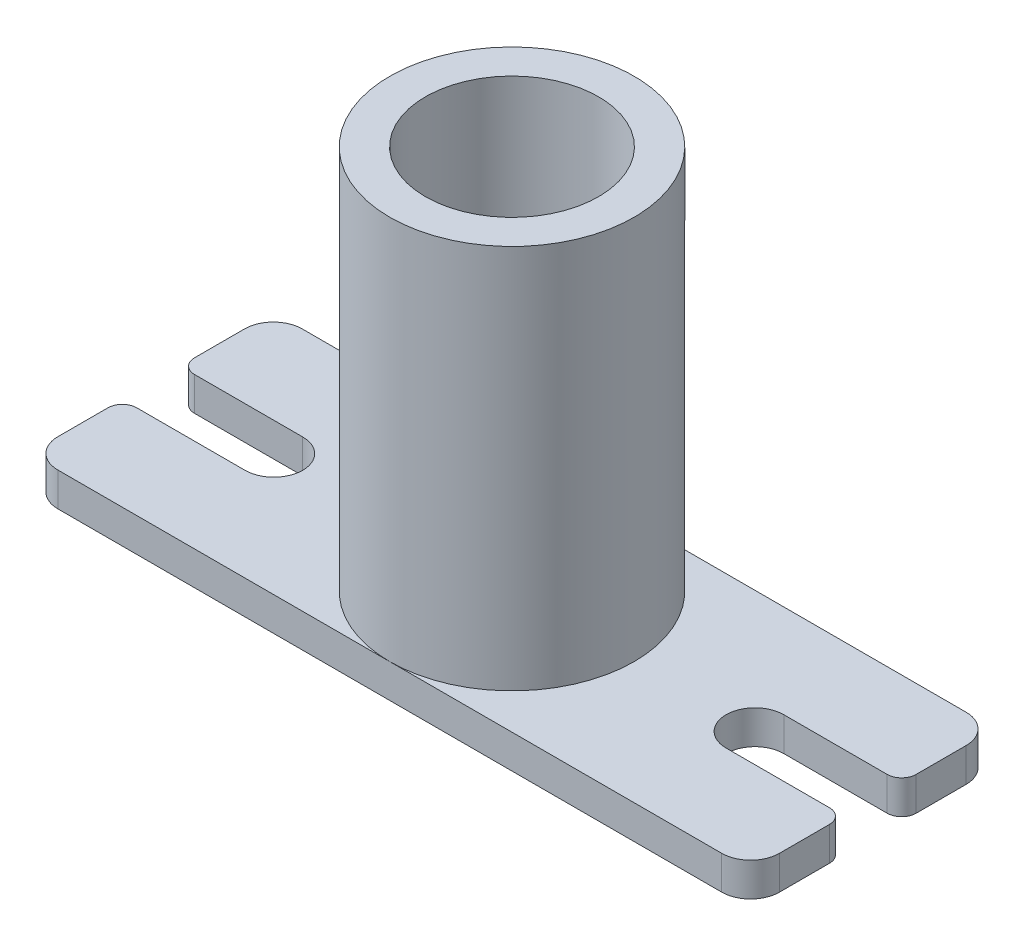
ISO-10303-21;
HEADER;
FILE_DESCRIPTION(('STEP AP214'),'2;1');
FILE_NAME('part.step','',(''),(''),'','','');
FILE_SCHEMA(('AUTOMOTIVE_DESIGN { 1 0 10303 214 1 1 1 1 }'));
ENDSEC;
DATA;
#1=APPLICATION_CONTEXT('core data for automotive mechanical design processes');
#2=APPLICATION_PROTOCOL_DEFINITION('international standard','automotive_design',2000,#1);
#3=PRODUCT_CONTEXT('',#1,'mechanical');
#4=PRODUCT('Part','Part','',(#3));
#5=PRODUCT_RELATED_PRODUCT_CATEGORY('part','',(#4));
#6=PRODUCT_DEFINITION_FORMATION('','',#4);
#7=PRODUCT_DEFINITION_CONTEXT('part definition',#1,'design');
#8=PRODUCT_DEFINITION('design','',#6,#7);
#9=PRODUCT_DEFINITION_SHAPE('','',#8);
#10=(LENGTH_UNIT() NAMED_UNIT(*) SI_UNIT(.MILLI.,.METRE.));
#11=(NAMED_UNIT(*) PLANE_ANGLE_UNIT() SI_UNIT($,.RADIAN.));
#12=(NAMED_UNIT(*) SI_UNIT($,.STERADIAN.) SOLID_ANGLE_UNIT());
#13=UNCERTAINTY_MEASURE_WITH_UNIT(LENGTH_MEASURE(1.E-05),#10,'distance_accuracy_value','');
#14=(GEOMETRIC_REPRESENTATION_CONTEXT(3) GLOBAL_UNCERTAINTY_ASSIGNED_CONTEXT((#13)) GLOBAL_UNIT_ASSIGNED_CONTEXT((#10,
#11,#12)) REPRESENTATION_CONTEXT('',''));
#15=CARTESIAN_POINT('',(0.,0.,0.));
#16=DIRECTION('',(0.,0.,1.));
#17=DIRECTION('',(1.,0.,0.));
#18=AXIS2_PLACEMENT_3D('',#15,#16,#17);
#19=CARTESIAN_POINT('',(3.20305311191606,3.5,-3.60082796255351));
#20=DIRECTION('',(0.,1.,0.));
#21=DIRECTION('',(0.,0.,1.));
#22=AXIS2_PLACEMENT_3D('',#19,#20,#21);
#23=PLANE('',#22);
#24=CARTESIAN_POINT('',(39.2030531119161,3.5,-8.10082796255352));
#25=DIRECTION('',(0.,1.,0.));
#26=DIRECTION('',(0.,0.,1.));
#27=AXIS2_PLACEMENT_3D('',#24,#25,#26);
#28=CIRCLE('',#27,12.7);
#29=CARTESIAN_POINT('',(39.2030531119161,3.5,4.59917203744653));
#30=VERTEX_POINT('',#29);
#31=CARTESIAN_POINT('',(39.2030531119161,3.5,-20.8008279625535));
#32=VERTEX_POINT('',#31);
#33=EDGE_CURVE('E230',#30,#32,#28,.T.);
#34=ORIENTED_EDGE('',*,*,#33,.F.);
#35=DIRECTION('',(1.,0.,0.));
#36=VECTOR('',#35,1.);
#37=CARTESIAN_POINT('',(4.70305311191608,3.5,4.59917203744648));
#38=LINE('',#37,#36);
#39=CARTESIAN_POINT('',(73.703053111916,3.5,4.59917203744648));
#40=VERTEX_POINT('',#39);
#41=EDGE_CURVE('E498',#30,#40,#38,.T.);
#42=ORIENTED_EDGE('',*,*,#41,.T.);
#43=CARTESIAN_POINT('',(73.703053111916,3.5,1.59917203744648));
#44=DIRECTION('',(0.,1.,0.));
#45=DIRECTION('',(0.,0.,1.));
#46=AXIS2_PLACEMENT_3D('',#43,#44,#45);
#47=CIRCLE('',#46,3.);
#48=CARTESIAN_POINT('',(76.703053111916,3.5,1.59917203744646));
#49=VERTEX_POINT('',#48);
#50=EDGE_CURVE('E488',#40,#49,#47,.T.);
#51=ORIENTED_EDGE('',*,*,#50,.T.);
#52=DIRECTION('',(0.,0.,-1.));
#53=VECTOR('',#52,1.);
#54=CARTESIAN_POINT('',(76.703053111916,3.5,-3.6008279625535));
#55=LINE('',#54,#53);
#56=CARTESIAN_POINT('',(76.703053111916,3.5,-3.6008279625535));
#57=VERTEX_POINT('',#56);
#58=EDGE_CURVE('E491',#49,#57,#55,.T.);
#59=ORIENTED_EDGE('',*,*,#58,.T.);
#60=CARTESIAN_POINT('',(75.203053111916,3.5,-3.60082796255351));
#61=DIRECTION('',(0.,1.,0.));
#62=DIRECTION('',(0.,0.,-1.));
#63=AXIS2_PLACEMENT_3D('',#60,#61,#62);
#64=CIRCLE('',#63,1.5);
#65=CARTESIAN_POINT('',(75.203053111916,3.5,-5.10082796255351));
#66=VERTEX_POINT('',#65);
#67=EDGE_CURVE('E496',#57,#66,#64,.T.);
#68=ORIENTED_EDGE('',*,*,#67,.T.);
#69=DIRECTION('',(-1.,0.,0.));
#70=VECTOR('',#69,1.);
#71=CARTESIAN_POINT('',(64.4530531119161,3.5,-5.10082796255351));
#72=LINE('',#71,#70);
#73=CARTESIAN_POINT('',(64.4530531119161,3.5,-5.10082796255351));
#74=VERTEX_POINT('',#73);
#75=EDGE_CURVE('E504',#66,#74,#72,.T.);
#76=ORIENTED_EDGE('',*,*,#75,.T.);
#77=CARTESIAN_POINT('',(64.4530531119161,3.5,-8.10082796255352));
#78=DIRECTION('',(0.,-1.,0.));
#79=DIRECTION('',(0.,0.,1.));
#80=AXIS2_PLACEMENT_3D('',#77,#78,#79);
#81=CIRCLE('',#80,3.00000000000001);
#82=CARTESIAN_POINT('',(64.4530531119161,3.5,-11.1008279625535));
#83=VERTEX_POINT('',#82);
#84=EDGE_CURVE('E507',#74,#83,#81,.T.);
#85=ORIENTED_EDGE('',*,*,#84,.T.);
#86=DIRECTION('',(1.,0.,0.));
#87=VECTOR('',#86,1.);
#88=CARTESIAN_POINT('',(64.4530531119161,3.5,-11.1008279625535));
#89=LINE('',#88,#87);
#90=CARTESIAN_POINT('',(75.203053111916,3.5,-11.1008279625535));
#91=VERTEX_POINT('',#90);
#92=EDGE_CURVE('E510',#83,#91,#89,.T.);
#93=ORIENTED_EDGE('',*,*,#92,.T.);
#94=CARTESIAN_POINT('',(75.203053111916,3.5,-12.6008279625535));
#95=DIRECTION('',(0.,1.,0.));
#96=DIRECTION('',(0.,0.,1.));
#97=AXIS2_PLACEMENT_3D('',#94,#95,#96);
#98=CIRCLE('',#97,1.5);
#99=CARTESIAN_POINT('',(76.703053111916,3.5,-12.6008279625535));
#100=VERTEX_POINT('',#99);
#101=EDGE_CURVE('E513',#91,#100,#98,.T.);
#102=ORIENTED_EDGE('',*,*,#101,.T.);
#103=DIRECTION('',(0.,0.,-1.));
#104=VECTOR('',#103,1.);
#105=CARTESIAN_POINT('',(76.703053111916,3.5,-17.8008279625535));
#106=LINE('',#105,#104);
#107=CARTESIAN_POINT('',(76.703053111916,3.5,-17.8008279625535));
#108=VERTEX_POINT('',#107);
#109=EDGE_CURVE('E516',#100,#108,#106,.T.);
#110=ORIENTED_EDGE('',*,*,#109,.T.);
#111=CARTESIAN_POINT('',(73.703053111916,3.5,-17.8008279625535));
#112=DIRECTION('',(0.,1.,0.));
#113=DIRECTION('',(0.,0.,-1.));
#114=AXIS2_PLACEMENT_3D('',#111,#112,#113);
#115=CIRCLE('',#114,3.);
#116=CARTESIAN_POINT('',(73.703053111916,3.5,-20.8008279625535));
#117=VERTEX_POINT('',#116);
#118=EDGE_CURVE('E519',#108,#117,#115,.T.);
#119=ORIENTED_EDGE('',*,*,#118,.T.);
#120=DIRECTION('',(-1.,0.,0.));
#121=VECTOR('',#120,1.);
#122=CARTESIAN_POINT('',(4.70305311191608,3.5,-20.8008279625535));
#123=LINE('',#122,#121);
#124=EDGE_CURVE('E523',#117,#32,#123,.T.);
#125=ORIENTED_EDGE('',*,*,#124,.T.);
#126=EDGE_LOOP('',(#34,#42,#51,#59,#68,#76,#85,#93,#102,#110,#119,#125));
#127=FACE_BOUND('',#126,.T.);
#128=ADVANCED_FACE('F43',(#127),#23,.T.);
#129=CARTESIAN_POINT('',(3.20305311191606,3.5,-3.60082796255351));
#130=DIRECTION('',(0.,-1.,0.));
#131=DIRECTION('',(0.,0.,-1.));
#132=AXIS2_PLACEMENT_3D('',#129,#130,#131);
#133=CYLINDRICAL_SURFACE('',#132,1.5);
#134=CARTESIAN_POINT('',(3.20305311191606,0.,-3.60082796255351));
#135=DIRECTION('',(0.,1.,0.));
#136=DIRECTION('',(0.,0.,1.));
#137=AXIS2_PLACEMENT_3D('',#134,#135,#136);
#138=CIRCLE('',#137,1.5);
#139=CARTESIAN_POINT('',(3.20305311191607,0.,-5.10082796255351));
#140=VERTEX_POINT('',#139);
#141=CARTESIAN_POINT('',(1.70305311191606,0.,-3.6008279625535));
#142=VERTEX_POINT('',#141);
#143=EDGE_CURVE('E225',#140,#142,#138,.T.);
#144=ORIENTED_EDGE('',*,*,#143,.T.);
#145=DIRECTION('',(0.,-1.,0.));
#146=VECTOR('',#145,1.);
#147=CARTESIAN_POINT('',(1.70305311191606,3.5,-3.6008279625535));
#148=LINE('',#147,#146);
#149=CARTESIAN_POINT('',(1.70305311191606,3.5,-3.6008279625535));
#150=VERTEX_POINT('',#149);
#151=EDGE_CURVE('E351',#150,#142,#148,.T.);
#152=ORIENTED_EDGE('',*,*,#151,.F.);
#153=CARTESIAN_POINT('',(3.20305311191606,3.5,-3.60082796255351));
#154=DIRECTION('',(0.,1.,0.));
#155=DIRECTION('',(0.,0.,1.));
#156=AXIS2_PLACEMENT_3D('',#153,#154,#155);
#157=CIRCLE('',#156,1.5);
#158=CARTESIAN_POINT('',(3.20305311191607,3.5,-5.10082796255351));
#159=VERTEX_POINT('',#158);
#160=EDGE_CURVE('E285',#159,#150,#157,.T.);
#161=ORIENTED_EDGE('',*,*,#160,.F.);
#162=DIRECTION('',(0.,-1.,0.));
#163=VECTOR('',#162,1.);
#164=CARTESIAN_POINT('',(3.20305311191607,3.5,-5.10082796255351));
#165=LINE('',#164,#163);
#166=EDGE_CURVE('E221',#159,#140,#165,.T.);
#167=ORIENTED_EDGE('',*,*,#166,.T.);
#168=EDGE_LOOP('',(#144,#152,#161,#167));
#169=FACE_BOUND('',#168,.T.);
#170=ADVANCED_FACE('F45',(#169),#133,.T.);
#171=CARTESIAN_POINT('',(1.70305311191606,3.5,-3.6008279625535));
#172=DIRECTION('',(1.,0.,0.));
#173=DIRECTION('',(0.,0.,-1.));
#174=AXIS2_PLACEMENT_3D('',#171,#172,#173);
#175=PLANE('',#174);
#176=DIRECTION('',(0.,0.,1.));
#177=VECTOR('',#176,1.);
#178=CARTESIAN_POINT('',(1.70305311191606,0.,-3.6008279625535));
#179=LINE('',#178,#177);
#180=CARTESIAN_POINT('',(1.70305311191606,0.,1.59917203744646));
#181=VERTEX_POINT('',#180);
#182=EDGE_CURVE('E229',#142,#181,#179,.T.);
#183=ORIENTED_EDGE('',*,*,#182,.T.);
#184=DIRECTION('',(0.,-1.,0.));
#185=VECTOR('',#184,1.);
#186=CARTESIAN_POINT('',(1.70305311191606,3.5,1.59917203744646));
#187=LINE('',#186,#185);
#188=CARTESIAN_POINT('',(1.70305311191606,3.5,1.59917203744646));
#189=VERTEX_POINT('',#188);
#190=EDGE_CURVE('E348',#189,#181,#187,.T.);
#191=ORIENTED_EDGE('',*,*,#190,.F.);
#192=DIRECTION('',(0.,0.,1.));
#193=VECTOR('',#192,1.);
#194=CARTESIAN_POINT('',(1.70305311191606,3.5,-3.6008279625535));
#195=LINE('',#194,#193);
#196=EDGE_CURVE('E144',#150,#189,#195,.T.);
#197=ORIENTED_EDGE('',*,*,#196,.F.);
#198=ORIENTED_EDGE('',*,*,#151,.T.);
#199=EDGE_LOOP('',(#183,#191,#197,#198));
#200=FACE_BOUND('',#199,.T.);
#201=ADVANCED_FACE('F395',(#200),#175,.F.);
#202=CARTESIAN_POINT('',(4.70305311191605,3.5,1.59917203744648));
#203=DIRECTION('',(0.,-1.,0.));
#204=DIRECTION('',(0.,0.,-1.));
#205=AXIS2_PLACEMENT_3D('',#202,#203,#204);
#206=CYLINDRICAL_SURFACE('',#205,3.);
#207=CARTESIAN_POINT('',(4.70305311191605,0.,1.59917203744648));
#208=DIRECTION('',(0.,1.,0.));
#209=DIRECTION('',(0.,0.,-1.));
#210=AXIS2_PLACEMENT_3D('',#207,#208,#209);
#211=CIRCLE('',#210,3.);
#212=CARTESIAN_POINT('',(4.70305311191608,0.,4.59917203744648));
#213=VERTEX_POINT('',#212);
#214=EDGE_CURVE('E233',#181,#213,#211,.T.);
#215=ORIENTED_EDGE('',*,*,#214,.T.);
#216=DIRECTION('',(0.,-1.,0.));
#217=VECTOR('',#216,1.);
#218=CARTESIAN_POINT('',(4.70305311191608,3.5,4.59917203744648));
#219=LINE('',#218,#217);
#220=CARTESIAN_POINT('',(4.70305311191608,3.5,4.59917203744648));
#221=VERTEX_POINT('',#220);
#222=EDGE_CURVE('E344',#221,#213,#219,.T.);
#223=ORIENTED_EDGE('',*,*,#222,.F.);
#224=CARTESIAN_POINT('',(4.70305311191605,3.5,1.59917203744648));
#225=DIRECTION('',(0.,1.,0.));
#226=DIRECTION('',(0.,0.,-1.));
#227=AXIS2_PLACEMENT_3D('',#224,#225,#226);
#228=CIRCLE('',#227,3.);
#229=EDGE_CURVE('E479',#189,#221,#228,.T.);
#230=ORIENTED_EDGE('',*,*,#229,.F.);
#231=ORIENTED_EDGE('',*,*,#190,.T.);
#232=EDGE_LOOP('',(#215,#223,#230,#231));
#233=FACE_BOUND('',#232,.T.);
#234=ADVANCED_FACE('F468',(#233),#206,.T.);
#235=CARTESIAN_POINT('',(4.70305311191608,3.5,4.59917203744648));
#236=DIRECTION('',(0.,0.,-1.));
#237=DIRECTION('',(-1.,0.,0.));
#238=AXIS2_PLACEMENT_3D('',#235,#236,#237);
#239=PLANE('',#238);
#240=DIRECTION('',(1.,0.,0.));
#241=VECTOR('',#240,1.);
#242=CARTESIAN_POINT('',(4.70305311191608,0.,4.59917203744648));
#243=LINE('',#242,#241);
#244=CARTESIAN_POINT('',(73.703053111916,0.,4.59917203744648));
#245=VERTEX_POINT('',#244);
#246=EDGE_CURVE('E236',#213,#245,#243,.T.);
#247=ORIENTED_EDGE('',*,*,#246,.T.);
#248=DIRECTION('',(0.,-1.,0.));
#249=VECTOR('',#248,1.);
#250=CARTESIAN_POINT('',(73.703053111916,3.5,4.59917203744648));
#251=LINE('',#250,#249);
#252=EDGE_CURVE('E340',#40,#245,#251,.T.);
#253=ORIENTED_EDGE('',*,*,#252,.F.);
#254=ORIENTED_EDGE('',*,*,#41,.F.);
#255=EDGE_CURVE('E492',#221,#30,#38,.T.);
#256=ORIENTED_EDGE('',*,*,#255,.F.);
#257=ORIENTED_EDGE('',*,*,#222,.T.);
#258=EDGE_LOOP('',(#247,#253,#254,#256,#257));
#259=FACE_BOUND('',#258,.T.);
#260=ADVANCED_FACE('F464',(#259),#239,.F.);
#261=CARTESIAN_POINT('',(73.703053111916,3.5,1.59917203744648));
#262=DIRECTION('',(0.,-1.,0.));
#263=DIRECTION('',(0.,0.,-1.));
#264=AXIS2_PLACEMENT_3D('',#261,#262,#263);
#265=CYLINDRICAL_SURFACE('',#264,3.);
#266=CARTESIAN_POINT('',(73.703053111916,0.,1.59917203744648));
#267=DIRECTION('',(0.,1.,0.));
#268=DIRECTION('',(0.,0.,1.));
#269=AXIS2_PLACEMENT_3D('',#266,#267,#268);
#270=CIRCLE('',#269,3.);
#271=CARTESIAN_POINT('',(76.703053111916,0.,1.59917203744646));
#272=VERTEX_POINT('',#271);
#273=EDGE_CURVE('E239',#245,#272,#270,.T.);
#274=ORIENTED_EDGE('',*,*,#273,.T.);
#275=DIRECTION('',(0.,-1.,0.));
#276=VECTOR('',#275,1.);
#277=CARTESIAN_POINT('',(76.703053111916,3.5,1.59917203744646));
#278=LINE('',#277,#276);
#279=EDGE_CURVE('E336',#49,#272,#278,.T.);
#280=ORIENTED_EDGE('',*,*,#279,.F.);
#281=ORIENTED_EDGE('',*,*,#50,.F.);
#282=ORIENTED_EDGE('',*,*,#252,.T.);
#283=EDGE_LOOP('',(#274,#280,#281,#282));
#284=FACE_BOUND('',#283,.T.);
#285=ADVANCED_FACE('F460',(#284),#265,.T.);
#286=CARTESIAN_POINT('',(76.703053111916,3.5,-3.6008279625535));
#287=DIRECTION('',(-1.,0.,0.));
#288=DIRECTION('',(0.,0.,1.));
#289=AXIS2_PLACEMENT_3D('',#286,#287,#288);
#290=PLANE('',#289);
#291=DIRECTION('',(0.,0.,-1.));
#292=VECTOR('',#291,1.);
#293=CARTESIAN_POINT('',(76.703053111916,0.,-3.6008279625535));
#294=LINE('',#293,#292);
#295=CARTESIAN_POINT('',(76.703053111916,0.,-3.6008279625535));
#296=VERTEX_POINT('',#295);
#297=EDGE_CURVE('E242',#272,#296,#294,.T.);
#298=ORIENTED_EDGE('',*,*,#297,.T.);
#299=DIRECTION('',(0.,-1.,0.));
#300=VECTOR('',#299,1.);
#301=CARTESIAN_POINT('',(76.703053111916,3.5,-3.6008279625535));
#302=LINE('',#301,#300);
#303=EDGE_CURVE('E332',#57,#296,#302,.T.);
#304=ORIENTED_EDGE('',*,*,#303,.F.);
#305=ORIENTED_EDGE('',*,*,#58,.F.);
#306=ORIENTED_EDGE('',*,*,#279,.T.);
#307=EDGE_LOOP('',(#298,#304,#305,#306));
#308=FACE_BOUND('',#307,.T.);
#309=ADVANCED_FACE('F456',(#308),#290,.F.);
#310=CARTESIAN_POINT('',(75.203053111916,3.5,-3.60082796255351));
#311=DIRECTION('',(0.,-1.,0.));
#312=DIRECTION('',(0.,0.,-1.));
#313=AXIS2_PLACEMENT_3D('',#310,#311,#312);
#314=CYLINDRICAL_SURFACE('',#313,1.5);
#315=CARTESIAN_POINT('',(75.203053111916,0.,-3.60082796255351));
#316=DIRECTION('',(0.,1.,0.));
#317=DIRECTION('',(0.,0.,-1.));
#318=AXIS2_PLACEMENT_3D('',#315,#316,#317);
#319=CIRCLE('',#318,1.5);
#320=CARTESIAN_POINT('',(75.203053111916,0.,-5.10082796255351));
#321=VERTEX_POINT('',#320);
#322=EDGE_CURVE('E245',#296,#321,#319,.T.);
#323=ORIENTED_EDGE('',*,*,#322,.T.);
#324=DIRECTION('',(0.,-1.,0.));
#325=VECTOR('',#324,1.);
#326=CARTESIAN_POINT('',(75.203053111916,3.5,-5.10082796255351));
#327=LINE('',#326,#325);
#328=EDGE_CURVE('E328',#66,#321,#327,.T.);
#329=ORIENTED_EDGE('',*,*,#328,.F.);
#330=ORIENTED_EDGE('',*,*,#67,.F.);
#331=ORIENTED_EDGE('',*,*,#303,.T.);
#332=EDGE_LOOP('',(#323,#329,#330,#331));
#333=FACE_BOUND('',#332,.T.);
#334=ADVANCED_FACE('F452',(#333),#314,.T.);
#335=CARTESIAN_POINT('',(64.4530531119161,3.5,-5.10082796255351));
#336=DIRECTION('',(0.,0.,1.));
#337=DIRECTION('',(1.,0.,0.));
#338=AXIS2_PLACEMENT_3D('',#335,#336,#337);
#339=PLANE('',#338);
#340=DIRECTION('',(-1.,0.,0.));
#341=VECTOR('',#340,1.);
#342=CARTESIAN_POINT('',(64.4530531119161,0.,-5.10082796255351));
#343=LINE('',#342,#341);
#344=CARTESIAN_POINT('',(64.4530531119161,0.,-5.10082796255351));
#345=VERTEX_POINT('',#344);
#346=EDGE_CURVE('E248',#321,#345,#343,.T.);
#347=ORIENTED_EDGE('',*,*,#346,.T.);
#348=DIRECTION('',(0.,-1.,0.));
#349=VECTOR('',#348,1.);
#350=CARTESIAN_POINT('',(64.4530531119161,3.5,-5.10082796255351));
#351=LINE('',#350,#349);
#352=EDGE_CURVE('E324',#74,#345,#351,.T.);
#353=ORIENTED_EDGE('',*,*,#352,.F.);
#354=ORIENTED_EDGE('',*,*,#75,.F.);
#355=ORIENTED_EDGE('',*,*,#328,.T.);
#356=EDGE_LOOP('',(#347,#353,#354,#355));
#357=FACE_BOUND('',#356,.T.);
#358=ADVANCED_FACE('F448',(#357),#339,.F.);
#359=CARTESIAN_POINT('',(64.4530531119161,3.5,-8.10082796255352));
#360=DIRECTION('',(0.,-1.,0.));
#361=DIRECTION('',(0.,0.,-1.));
#362=AXIS2_PLACEMENT_3D('',#359,#360,#361);
#363=CYLINDRICAL_SURFACE('',#362,3.00000000000001);
#364=CARTESIAN_POINT('',(64.4530531119161,0.,-8.10082796255352));
#365=DIRECTION('',(0.,-1.,0.));
#366=DIRECTION('',(0.,0.,1.));
#367=AXIS2_PLACEMENT_3D('',#364,#365,#366);
#368=CIRCLE('',#367,3.00000000000001);
#369=CARTESIAN_POINT('',(64.4530531119161,0.,-11.1008279625535));
#370=VERTEX_POINT('',#369);
#371=EDGE_CURVE('E251',#345,#370,#368,.T.);
#372=ORIENTED_EDGE('',*,*,#371,.T.);
#373=DIRECTION('',(0.,-1.,0.));
#374=VECTOR('',#373,1.);
#375=CARTESIAN_POINT('',(64.4530531119161,3.5,-11.1008279625535));
#376=LINE('',#375,#374);
#377=EDGE_CURVE('E320',#83,#370,#376,.T.);
#378=ORIENTED_EDGE('',*,*,#377,.F.);
#379=ORIENTED_EDGE('',*,*,#84,.F.);
#380=ORIENTED_EDGE('',*,*,#352,.T.);
#381=EDGE_LOOP('',(#372,#378,#379,#380));
#382=FACE_BOUND('',#381,.T.);
#383=ADVANCED_FACE('F444',(#382),#363,.F.);
#384=CARTESIAN_POINT('',(64.4530531119161,3.5,-11.1008279625535));
#385=DIRECTION('',(0.,0.,-1.));
#386=DIRECTION('',(-1.,0.,0.));
#387=AXIS2_PLACEMENT_3D('',#384,#385,#386);
#388=PLANE('',#387);
#389=DIRECTION('',(1.,0.,0.));
#390=VECTOR('',#389,1.);
#391=CARTESIAN_POINT('',(64.4530531119161,0.,-11.1008279625535));
#392=LINE('',#391,#390);
#393=CARTESIAN_POINT('',(75.203053111916,0.,-11.1008279625535));
#394=VERTEX_POINT('',#393);
#395=EDGE_CURVE('E254',#370,#394,#392,.T.);
#396=ORIENTED_EDGE('',*,*,#395,.T.);
#397=DIRECTION('',(0.,-1.,0.));
#398=VECTOR('',#397,1.);
#399=CARTESIAN_POINT('',(75.203053111916,3.5,-11.1008279625535));
#400=LINE('',#399,#398);
#401=EDGE_CURVE('E316',#91,#394,#400,.T.);
#402=ORIENTED_EDGE('',*,*,#401,.F.);
#403=ORIENTED_EDGE('',*,*,#92,.F.);
#404=ORIENTED_EDGE('',*,*,#377,.T.);
#405=EDGE_LOOP('',(#396,#402,#403,#404));
#406=FACE_BOUND('',#405,.T.);
#407=ADVANCED_FACE('F440',(#406),#388,.F.);
#408=CARTESIAN_POINT('',(75.203053111916,3.5,-12.6008279625535));
#409=DIRECTION('',(0.,-1.,0.));
#410=DIRECTION('',(0.,0.,-1.));
#411=AXIS2_PLACEMENT_3D('',#408,#409,#410);
#412=CYLINDRICAL_SURFACE('',#411,1.5);
#413=CARTESIAN_POINT('',(75.203053111916,0.,-12.6008279625535));
#414=DIRECTION('',(0.,1.,0.));
#415=DIRECTION('',(0.,0.,1.));
#416=AXIS2_PLACEMENT_3D('',#413,#414,#415);
#417=CIRCLE('',#416,1.5);
#418=CARTESIAN_POINT('',(76.703053111916,0.,-12.6008279625535));
#419=VERTEX_POINT('',#418);
#420=EDGE_CURVE('E257',#394,#419,#417,.T.);
#421=ORIENTED_EDGE('',*,*,#420,.T.);
#422=DIRECTION('',(0.,-1.,0.));
#423=VECTOR('',#422,1.);
#424=CARTESIAN_POINT('',(76.703053111916,3.5,-12.6008279625535));
#425=LINE('',#424,#423);
#426=EDGE_CURVE('E312',#100,#419,#425,.T.);
#427=ORIENTED_EDGE('',*,*,#426,.F.);
#428=ORIENTED_EDGE('',*,*,#101,.F.);
#429=ORIENTED_EDGE('',*,*,#401,.T.);
#430=EDGE_LOOP('',(#421,#427,#428,#429));
#431=FACE_BOUND('',#430,.T.);
#432=ADVANCED_FACE('F436',(#431),#412,.T.);
#433=CARTESIAN_POINT('',(76.703053111916,3.5,-17.8008279625535));
#434=DIRECTION('',(-1.,0.,0.));
#435=DIRECTION('',(0.,0.,1.));
#436=AXIS2_PLACEMENT_3D('',#433,#434,#435);
#437=PLANE('',#436);
#438=DIRECTION('',(0.,0.,-1.));
#439=VECTOR('',#438,1.);
#440=CARTESIAN_POINT('',(76.703053111916,0.,-17.8008279625535));
#441=LINE('',#440,#439);
#442=CARTESIAN_POINT('',(76.703053111916,0.,-17.8008279625535));
#443=VERTEX_POINT('',#442);
#444=EDGE_CURVE('E260',#419,#443,#441,.T.);
#445=ORIENTED_EDGE('',*,*,#444,.T.);
#446=DIRECTION('',(0.,-1.,0.));
#447=VECTOR('',#446,1.);
#448=CARTESIAN_POINT('',(76.703053111916,3.5,-17.8008279625535));
#449=LINE('',#448,#447);
#450=EDGE_CURVE('E308',#108,#443,#449,.T.);
#451=ORIENTED_EDGE('',*,*,#450,.F.);
#452=ORIENTED_EDGE('',*,*,#109,.F.);
#453=ORIENTED_EDGE('',*,*,#426,.T.);
#454=EDGE_LOOP('',(#445,#451,#452,#453));
#455=FACE_BOUND('',#454,.T.);
#456=ADVANCED_FACE('F432',(#455),#437,.F.);
#457=CARTESIAN_POINT('',(73.703053111916,3.5,-17.8008279625535));
#458=DIRECTION('',(0.,-1.,0.));
#459=DIRECTION('',(0.,0.,-1.));
#460=AXIS2_PLACEMENT_3D('',#457,#458,#459);
#461=CYLINDRICAL_SURFACE('',#460,3.);
#462=CARTESIAN_POINT('',(73.703053111916,0.,-17.8008279625535));
#463=DIRECTION('',(0.,1.,0.));
#464=DIRECTION('',(0.,0.,-1.));
#465=AXIS2_PLACEMENT_3D('',#462,#463,#464);
#466=CIRCLE('',#465,3.);
#467=CARTESIAN_POINT('',(73.703053111916,0.,-20.8008279625535));
#468=VERTEX_POINT('',#467);
#469=EDGE_CURVE('E263',#443,#468,#466,.T.);
#470=ORIENTED_EDGE('',*,*,#469,.T.);
#471=DIRECTION('',(0.,-1.,0.));
#472=VECTOR('',#471,1.);
#473=CARTESIAN_POINT('',(73.703053111916,3.5,-20.8008279625535));
#474=LINE('',#473,#472);
#475=EDGE_CURVE('E304',#117,#468,#474,.T.);
#476=ORIENTED_EDGE('',*,*,#475,.F.);
#477=ORIENTED_EDGE('',*,*,#118,.F.);
#478=ORIENTED_EDGE('',*,*,#450,.T.);
#479=EDGE_LOOP('',(#470,#476,#477,#478));
#480=FACE_BOUND('',#479,.T.);
#481=ADVANCED_FACE('F428',(#480),#461,.T.);
#482=CARTESIAN_POINT('',(4.70305311191608,3.5,-20.8008279625535));
#483=DIRECTION('',(0.,0.,1.));
#484=DIRECTION('',(1.,0.,0.));
#485=AXIS2_PLACEMENT_3D('',#482,#483,#484);
#486=PLANE('',#485);
#487=DIRECTION('',(-1.,0.,0.));
#488=VECTOR('',#487,1.);
#489=CARTESIAN_POINT('',(4.70305311191608,0.,-20.8008279625535));
#490=LINE('',#489,#488);
#491=CARTESIAN_POINT('',(4.70305311191608,0.,-20.8008279625535));
#492=VERTEX_POINT('',#491);
#493=EDGE_CURVE('E266',#468,#492,#490,.T.);
#494=ORIENTED_EDGE('',*,*,#493,.T.);
#495=DIRECTION('',(0.,-1.,0.));
#496=VECTOR('',#495,1.);
#497=CARTESIAN_POINT('',(4.70305311191608,3.5,-20.8008279625535));
#498=LINE('',#497,#496);
#499=CARTESIAN_POINT('',(4.70305311191608,3.5,-20.8008279625535));
#500=VERTEX_POINT('',#499);
#501=EDGE_CURVE('E300',#500,#492,#498,.T.);
#502=ORIENTED_EDGE('',*,*,#501,.F.);
#503=EDGE_CURVE('E522',#32,#500,#123,.T.);
#504=ORIENTED_EDGE('',*,*,#503,.F.);
#505=ORIENTED_EDGE('',*,*,#124,.F.);
#506=ORIENTED_EDGE('',*,*,#475,.T.);
#507=EDGE_LOOP('',(#494,#502,#504,#505,#506));
#508=FACE_BOUND('',#507,.T.);
#509=ADVANCED_FACE('F424',(#508),#486,.F.);
#510=CARTESIAN_POINT('',(4.70305311191605,3.5,-17.8008279625535));
#511=DIRECTION('',(0.,-1.,0.));
#512=DIRECTION('',(0.,0.,-1.));
#513=AXIS2_PLACEMENT_3D('',#510,#511,#512);
#514=CYLINDRICAL_SURFACE('',#513,3.);
#515=CARTESIAN_POINT('',(4.70305311191605,0.,-17.8008279625535));
#516=DIRECTION('',(0.,1.,0.));
#517=DIRECTION('',(0.,0.,1.));
#518=AXIS2_PLACEMENT_3D('',#515,#516,#517);
#519=CIRCLE('',#518,3.);
#520=CARTESIAN_POINT('',(1.70305311191606,0.,-17.8008279625535));
#521=VERTEX_POINT('',#520);
#522=EDGE_CURVE('E269',#492,#521,#519,.T.);
#523=ORIENTED_EDGE('',*,*,#522,.T.);
#524=DIRECTION('',(0.,-1.,0.));
#525=VECTOR('',#524,1.);
#526=CARTESIAN_POINT('',(1.70305311191606,3.5,-17.8008279625535));
#527=LINE('',#526,#525);
#528=CARTESIAN_POINT('',(1.70305311191606,3.5,-17.8008279625535));
#529=VERTEX_POINT('',#528);
#530=EDGE_CURVE('E296',#529,#521,#527,.T.);
#531=ORIENTED_EDGE('',*,*,#530,.F.);
#532=CARTESIAN_POINT('',(4.70305311191605,3.5,-17.8008279625535));
#533=DIRECTION('',(0.,1.,0.));
#534=DIRECTION('',(0.,0.,1.));
#535=AXIS2_PLACEMENT_3D('',#532,#533,#534);
#536=CIRCLE('',#535,3.);
#537=EDGE_CURVE('E527',#500,#529,#536,.T.);
#538=ORIENTED_EDGE('',*,*,#537,.F.);
#539=ORIENTED_EDGE('',*,*,#501,.T.);
#540=EDGE_LOOP('',(#523,#531,#538,#539));
#541=FACE_BOUND('',#540,.T.);
#542=ADVANCED_FACE('F420',(#541),#514,.T.);
#543=CARTESIAN_POINT('',(1.70305311191606,3.5,-17.8008279625535));
#544=DIRECTION('',(1.,0.,0.));
#545=DIRECTION('',(0.,0.,-1.));
#546=AXIS2_PLACEMENT_3D('',#543,#544,#545);
#547=PLANE('',#546);
#548=DIRECTION('',(0.,0.,1.));
#549=VECTOR('',#548,1.);
#550=CARTESIAN_POINT('',(1.70305311191606,0.,-17.8008279625535));
#551=LINE('',#550,#549);
#552=CARTESIAN_POINT('',(1.70305311191606,0.,-12.6008279625535));
#553=VERTEX_POINT('',#552);
#554=EDGE_CURVE('E272',#521,#553,#551,.T.);
#555=ORIENTED_EDGE('',*,*,#554,.T.);
#556=DIRECTION('',(0.,-1.,0.));
#557=VECTOR('',#556,1.);
#558=CARTESIAN_POINT('',(1.70305311191606,3.5,-12.6008279625535));
#559=LINE('',#558,#557);
#560=CARTESIAN_POINT('',(1.70305311191606,3.5,-12.6008279625535));
#561=VERTEX_POINT('',#560);
#562=EDGE_CURVE('E292',#561,#553,#559,.T.);
#563=ORIENTED_EDGE('',*,*,#562,.F.);
#564=DIRECTION('',(0.,0.,1.));
#565=VECTOR('',#564,1.);
#566=CARTESIAN_POINT('',(1.70305311191606,3.5,-17.8008279625535));
#567=LINE('',#566,#565);
#568=EDGE_CURVE('E530',#529,#561,#567,.T.);
#569=ORIENTED_EDGE('',*,*,#568,.F.);
#570=ORIENTED_EDGE('',*,*,#530,.T.);
#571=EDGE_LOOP('',(#555,#563,#569,#570));
#572=FACE_BOUND('',#571,.T.);
#573=ADVANCED_FACE('F416',(#572),#547,.F.);
#574=CARTESIAN_POINT('',(3.20305311191606,3.5,-12.6008279625535));
#575=DIRECTION('',(0.,-1.,0.));
#576=DIRECTION('',(0.,0.,-1.));
#577=AXIS2_PLACEMENT_3D('',#574,#575,#576);
#578=CYLINDRICAL_SURFACE('',#577,1.5);
#579=CARTESIAN_POINT('',(3.20305311191606,0.,-12.6008279625535));
#580=DIRECTION('',(0.,1.,0.));
#581=DIRECTION('',(0.,0.,-1.));
#582=AXIS2_PLACEMENT_3D('',#579,#580,#581);
#583=CIRCLE('',#582,1.5);
#584=CARTESIAN_POINT('',(3.20305311191607,0.,-11.1008279625535));
#585=VERTEX_POINT('',#584);
#586=EDGE_CURVE('E275',#553,#585,#583,.T.);
#587=ORIENTED_EDGE('',*,*,#586,.T.);
#588=DIRECTION('',(0.,-1.,0.));
#589=VECTOR('',#588,1.);
#590=CARTESIAN_POINT('',(3.20305311191607,3.5,-11.1008279625535));
#591=LINE('',#590,#589);
#592=CARTESIAN_POINT('',(3.20305311191607,3.5,-11.1008279625535));
#593=VERTEX_POINT('',#592);
#594=EDGE_CURVE('E214',#593,#585,#591,.T.);
#595=ORIENTED_EDGE('',*,*,#594,.F.);
#596=CARTESIAN_POINT('',(3.20305311191606,3.5,-12.6008279625535));
#597=DIRECTION('',(0.,1.,0.));
#598=DIRECTION('',(0.,0.,-1.));
#599=AXIS2_PLACEMENT_3D('',#596,#597,#598);
#600=CIRCLE('',#599,1.5);
#601=EDGE_CURVE('E200',#561,#593,#600,.T.);
#602=ORIENTED_EDGE('',*,*,#601,.F.);
#603=ORIENTED_EDGE('',*,*,#562,.T.);
#604=EDGE_LOOP('',(#587,#595,#602,#603));
#605=FACE_BOUND('',#604,.T.);
#606=ADVANCED_FACE('F413',(#605),#578,.T.);
#607=CARTESIAN_POINT('',(14.4530531119161,3.5,-11.1008279625535));
#608=DIRECTION('',(0.,0.,-1.));
#609=DIRECTION('',(-1.,0.,0.));
#610=AXIS2_PLACEMENT_3D('',#607,#608,#609);
#611=PLANE('',#610);
#612=DIRECTION('',(1.,0.,0.));
#613=VECTOR('',#612,1.);
#614=CARTESIAN_POINT('',(14.4530531119161,0.,-11.1008279625535));
#615=LINE('',#614,#613);
#616=CARTESIAN_POINT('',(14.4530531119161,0.,-11.1008279625535));
#617=VERTEX_POINT('',#616);
#618=EDGE_CURVE('E210',#585,#617,#615,.T.);
#619=ORIENTED_EDGE('',*,*,#618,.T.);
#620=DIRECTION('',(0.,-1.,0.));
#621=VECTOR('',#620,1.);
#622=CARTESIAN_POINT('',(14.4530531119161,3.5,-11.1008279625535));
#623=LINE('',#622,#621);
#624=CARTESIAN_POINT('',(14.4530531119161,3.5,-11.1008279625535));
#625=VERTEX_POINT('',#624);
#626=EDGE_CURVE('E207',#625,#617,#623,.T.);
#627=ORIENTED_EDGE('',*,*,#626,.F.);
#628=DIRECTION('',(1.,0.,0.));
#629=VECTOR('',#628,1.);
#630=CARTESIAN_POINT('',(14.4530531119161,3.5,-11.1008279625535));
#631=LINE('',#630,#629);
#632=EDGE_CURVE('E193',#593,#625,#631,.T.);
#633=ORIENTED_EDGE('',*,*,#632,.F.);
#634=ORIENTED_EDGE('',*,*,#594,.T.);
#635=EDGE_LOOP('',(#619,#627,#633,#634));
#636=FACE_BOUND('',#635,.T.);
#637=ADVANCED_FACE('F208',(#636),#611,.F.);
#638=CARTESIAN_POINT('',(14.4530531119161,3.5,-8.10082796255352));
#639=DIRECTION('',(0.,-1.,0.));
#640=DIRECTION('',(0.,0.,-1.));
#641=AXIS2_PLACEMENT_3D('',#638,#639,#640);
#642=CYLINDRICAL_SURFACE('',#641,3.);
#643=CARTESIAN_POINT('',(14.4530531119161,0.,-8.10082796255352));
#644=DIRECTION('',(0.,-1.,0.));
#645=DIRECTION('',(0.,0.,1.));
#646=AXIS2_PLACEMENT_3D('',#643,#644,#645);
#647=CIRCLE('',#646,3.);
#648=CARTESIAN_POINT('',(14.4530531119161,0.,-5.10082796255351));
#649=VERTEX_POINT('',#648);
#650=EDGE_CURVE('E280',#617,#649,#647,.T.);
#651=ORIENTED_EDGE('',*,*,#650,.T.);
#652=DIRECTION('',(0.,-1.,0.));
#653=VECTOR('',#652,1.);
#654=CARTESIAN_POINT('',(14.4530531119161,3.5,-5.10082796255351));
#655=LINE('',#654,#653);
#656=CARTESIAN_POINT('',(14.4530531119161,3.5,-5.10082796255351));
#657=VERTEX_POINT('',#656);
#658=EDGE_CURVE('E215',#657,#649,#655,.T.);
#659=ORIENTED_EDGE('',*,*,#658,.F.);
#660=CARTESIAN_POINT('',(14.4530531119161,3.5,-8.10082796255352));
#661=DIRECTION('',(0.,-1.,0.));
#662=DIRECTION('',(0.,0.,1.));
#663=AXIS2_PLACEMENT_3D('',#660,#661,#662);
#664=CIRCLE('',#663,3.);
#665=EDGE_CURVE('E197',#625,#657,#664,.T.);
#666=ORIENTED_EDGE('',*,*,#665,.F.);
#667=ORIENTED_EDGE('',*,*,#626,.T.);
#668=EDGE_LOOP('',(#651,#659,#666,#667));
#669=FACE_BOUND('',#668,.T.);
#670=ADVANCED_FACE('F217',(#669),#642,.F.);
#671=CARTESIAN_POINT('',(14.4530531119161,3.5,-5.10082796255351));
#672=DIRECTION('',(0.,0.,1.));
#673=DIRECTION('',(1.,0.,0.));
#674=AXIS2_PLACEMENT_3D('',#671,#672,#673);
#675=PLANE('',#674);
#676=DIRECTION('',(-1.,0.,0.));
#677=VECTOR('',#676,1.);
#678=CARTESIAN_POINT('',(14.4530531119161,0.,-5.10082796255351));
#679=LINE('',#678,#677);
#680=EDGE_CURVE('E135',#649,#140,#679,.T.);
#681=ORIENTED_EDGE('',*,*,#680,.T.);
#682=ORIENTED_EDGE('',*,*,#166,.F.);
#683=DIRECTION('',(-1.,0.,0.));
#684=VECTOR('',#683,1.);
#685=CARTESIAN_POINT('',(14.4530531119161,3.5,-5.10082796255351));
#686=LINE('',#685,#684);
#687=EDGE_CURVE('E66',#657,#159,#686,.T.);
#688=ORIENTED_EDGE('',*,*,#687,.F.);
#689=ORIENTED_EDGE('',*,*,#658,.T.);
#690=EDGE_LOOP('',(#681,#682,#688,#689));
#691=FACE_BOUND('',#690,.T.);
#692=ADVANCED_FACE('F399',(#691),#675,.F.);
#693=EDGE_CURVE('E52',#32,#30,#28,.T.);
#694=ORIENTED_EDGE('',*,*,#693,.F.);
#695=ORIENTED_EDGE('',*,*,#503,.T.);
#696=ORIENTED_EDGE('',*,*,#537,.T.);
#697=ORIENTED_EDGE('',*,*,#568,.T.);
#698=ORIENTED_EDGE('',*,*,#601,.T.);
#699=ORIENTED_EDGE('',*,*,#632,.T.);
#700=ORIENTED_EDGE('',*,*,#665,.T.);
#701=ORIENTED_EDGE('',*,*,#687,.T.);
#702=ORIENTED_EDGE('',*,*,#160,.T.);
#703=ORIENTED_EDGE('',*,*,#196,.T.);
#704=ORIENTED_EDGE('',*,*,#229,.T.);
#705=ORIENTED_EDGE('',*,*,#255,.T.);
#706=EDGE_LOOP('',(#694,#695,#696,#697,#698,#699,#700,#701,#702,#703,#704,#705));
#707=FACE_BOUND('',#706,.T.);
#708=ADVANCED_FACE('F195',(#707),#23,.T.);
#709=CARTESIAN_POINT('',(3.20305311191606,0.,-3.60082796255351));
#710=DIRECTION('',(0.,1.,0.));
#711=DIRECTION('',(0.,0.,1.));
#712=AXIS2_PLACEMENT_3D('',#709,#710,#711);
#713=PLANE('',#712);
#714=ORIENTED_EDGE('',*,*,#143,.F.);
#715=ORIENTED_EDGE('',*,*,#680,.F.);
#716=ORIENTED_EDGE('',*,*,#650,.F.);
#717=ORIENTED_EDGE('',*,*,#618,.F.);
#718=ORIENTED_EDGE('',*,*,#586,.F.);
#719=ORIENTED_EDGE('',*,*,#554,.F.);
#720=ORIENTED_EDGE('',*,*,#522,.F.);
#721=ORIENTED_EDGE('',*,*,#493,.F.);
#722=ORIENTED_EDGE('',*,*,#469,.F.);
#723=ORIENTED_EDGE('',*,*,#444,.F.);
#724=ORIENTED_EDGE('',*,*,#420,.F.);
#725=ORIENTED_EDGE('',*,*,#395,.F.);
#726=ORIENTED_EDGE('',*,*,#371,.F.);
#727=ORIENTED_EDGE('',*,*,#346,.F.);
#728=ORIENTED_EDGE('',*,*,#322,.F.);
#729=ORIENTED_EDGE('',*,*,#297,.F.);
#730=ORIENTED_EDGE('',*,*,#273,.F.);
#731=ORIENTED_EDGE('',*,*,#246,.F.);
#732=ORIENTED_EDGE('',*,*,#214,.F.);
#733=ORIENTED_EDGE('',*,*,#182,.F.);
#734=EDGE_LOOP('',(#714,#715,#716,#717,#718,#719,#720,#721,#722,#723,#724,#725,#726,#727,#728,
#729,#730,#731,#732,#733));
#735=FACE_BOUND('',#734,.T.);
#736=ADVANCED_FACE('F386',(#735),#713,.F.);
#737=CARTESIAN_POINT('',(39.2030531119161,18.5,-8.10082796255352));
#738=DIRECTION('',(0.,-1.,0.));
#739=DIRECTION('',(0.,0.,-1.));
#740=AXIS2_PLACEMENT_3D('',#737,#738,#739);
#741=CYLINDRICAL_SURFACE('',#740,12.7);
#742=ORIENTED_EDGE('',*,*,#33,.T.);
#743=ORIENTED_EDGE('',*,*,#693,.T.);
#744=EDGE_LOOP('',(#742,#743));
#745=FACE_BOUND('',#744,.T.);
#746=CARTESIAN_POINT('',(39.2030531119161,43.5,-8.10082796255352));
#747=DIRECTION('',(0.,1.,0.));
#748=DIRECTION('',(0.,0.,1.));
#749=AXIS2_PLACEMENT_3D('',#746,#747,#748);
#750=CIRCLE('',#749,12.7);
#751=CARTESIAN_POINT('',(39.2030531119161,43.5,4.59917203744653));
#752=VERTEX_POINT('',#751);
#753=EDGE_CURVE('E361',#752,#752,#750,.T.);
#754=ORIENTED_EDGE('',*,*,#753,.F.);
#755=EDGE_LOOP('',(#754));
#756=FACE_BOUND('',#755,.T.);
#757=ADVANCED_FACE('F378',(#745,#756),#741,.T.);
#758=CARTESIAN_POINT('',(39.2030531119161,43.5,-8.10082796255352));
#759=DIRECTION('',(0.,1.,0.));
#760=DIRECTION('',(0.,0.,1.));
#761=AXIS2_PLACEMENT_3D('',#758,#759,#760);
#762=PLANE('',#761);
#763=ORIENTED_EDGE('',*,*,#753,.T.);
#764=EDGE_LOOP('',(#763));
#765=FACE_BOUND('',#764,.T.);
#766=CARTESIAN_POINT('',(39.2030531119161,43.5,-8.10082796255352));
#767=DIRECTION('',(0.,1.,0.));
#768=DIRECTION('',(0.,0.,1.));
#769=AXIS2_PLACEMENT_3D('',#766,#767,#768);
#770=CIRCLE('',#769,9.);
#771=CARTESIAN_POINT('',(39.2030531119161,43.5,0.899172037446485));
#772=VERTEX_POINT('',#771);
#773=EDGE_CURVE('E365',#772,#772,#770,.T.);
#774=ORIENTED_EDGE('',*,*,#773,.F.);
#775=EDGE_LOOP('',(#774));
#776=FACE_BOUND('',#775,.T.);
#777=ADVANCED_FACE('F376',(#765,#776),#762,.T.);
#778=CARTESIAN_POINT('',(39.2030531119161,43.5,-8.10082796255352));
#779=DIRECTION('',(0.,-1.,0.));
#780=DIRECTION('',(0.,0.,-1.));
#781=AXIS2_PLACEMENT_3D('',#778,#779,#780);
#782=CYLINDRICAL_SURFACE('',#781,9.);
#783=ORIENTED_EDGE('',*,*,#773,.T.);
#784=EDGE_LOOP('',(#783));
#785=FACE_BOUND('',#784,.T.);
#786=CARTESIAN_POINT('',(39.2030531119161,18.5,-8.10082796255352));
#787=DIRECTION('',(0.,1.,0.));
#788=DIRECTION('',(0.,0.,1.));
#789=AXIS2_PLACEMENT_3D('',#786,#787,#788);
#790=CIRCLE('',#789,9.);
#791=CARTESIAN_POINT('',(39.2030531119161,18.5,0.899172037446485));
#792=VERTEX_POINT('',#791);
#793=EDGE_CURVE('E11',#792,#792,#790,.F.);
#794=ORIENTED_EDGE('',*,*,#793,.T.);
#795=EDGE_LOOP('',(#794));
#796=FACE_BOUND('',#795,.T.);
#797=ADVANCED_FACE('F373',(#785,#796),#782,.F.);
#798=CARTESIAN_POINT('',(39.2030531119161,18.5,-8.10082796255352));
#799=DIRECTION('',(0.,1.,0.));
#800=DIRECTION('',(0.,0.,1.));
#801=AXIS2_PLACEMENT_3D('',#798,#799,#800);
#802=PLANE('',#801);
#803=ORIENTED_EDGE('',*,*,#793,.F.);
#804=EDGE_LOOP('',(#803));
#805=FACE_BOUND('',#804,.T.);
#806=ADVANCED_FACE('F384',(#805),#802,.T.);
#807=CLOSED_SHELL('',(#128,#170,#201,#234,#260,#285,#309,#334,#358,#383,#407,#432,#456,#481,
#509,#542,#573,#606,#637,#670,#692,#708,#736,#757,#777,#797,#806));
#808=MANIFOLD_SOLID_BREP('B2',#807);
#809=ADVANCED_BREP_SHAPE_REPRESENTATION('',(#18,#808),#14);
#810=SHAPE_DEFINITION_REPRESENTATION(#9,#809);
ENDSEC;
END-ISO-10303-21;
